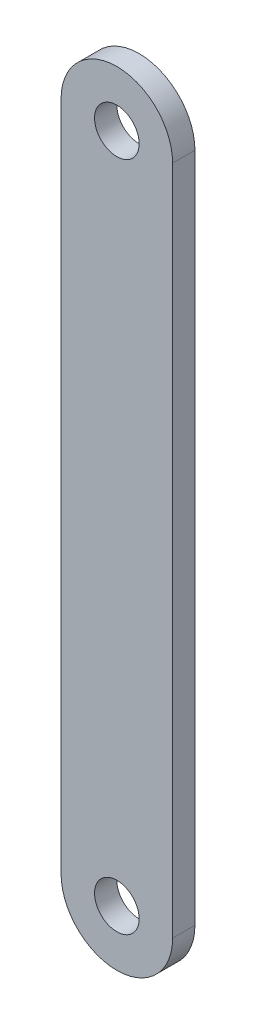
ISO-10303-21;
HEADER;
FILE_DESCRIPTION(('STEP AP214'),'2;1');
FILE_NAME('part.step','',(''),(''),'','','');
FILE_SCHEMA(('AUTOMOTIVE_DESIGN { 1 0 10303 214 1 1 1 1 }'));
ENDSEC;
DATA;
#1=APPLICATION_CONTEXT('core data for automotive mechanical design processes');
#2=APPLICATION_PROTOCOL_DEFINITION('international standard','automotive_design',2000,#1);
#3=PRODUCT_CONTEXT('',#1,'mechanical');
#4=PRODUCT('Part','Part','',(#3));
#5=PRODUCT_RELATED_PRODUCT_CATEGORY('part','',(#4));
#6=PRODUCT_DEFINITION_FORMATION('','',#4);
#7=PRODUCT_DEFINITION_CONTEXT('part definition',#1,'design');
#8=PRODUCT_DEFINITION('design','',#6,#7);
#9=PRODUCT_DEFINITION_SHAPE('','',#8);
#10=(LENGTH_UNIT() NAMED_UNIT(*) SI_UNIT(.MILLI.,.METRE.));
#11=(NAMED_UNIT(*) PLANE_ANGLE_UNIT() SI_UNIT($,.RADIAN.));
#12=(NAMED_UNIT(*) SI_UNIT($,.STERADIAN.) SOLID_ANGLE_UNIT());
#13=UNCERTAINTY_MEASURE_WITH_UNIT(LENGTH_MEASURE(1.E-05),#10,'distance_accuracy_value','');
#14=(GEOMETRIC_REPRESENTATION_CONTEXT(3) GLOBAL_UNCERTAINTY_ASSIGNED_CONTEXT((#13)) GLOBAL_UNIT_ASSIGNED_CONTEXT((#10,
#11,#12)) REPRESENTATION_CONTEXT('',''));
#15=CARTESIAN_POINT('',(0.,0.,0.));
#16=DIRECTION('',(0.,0.,1.));
#17=DIRECTION('',(1.,0.,0.));
#18=AXIS2_PLACEMENT_3D('',#15,#16,#17);
#19=CARTESIAN_POINT('',(25.,0.,10.));
#20=DIRECTION('',(0.,0.,1.));
#21=DIRECTION('',(1.,0.,0.));
#22=AXIS2_PLACEMENT_3D('',#19,#20,#21);
#23=PLANE('',#22);
#24=CARTESIAN_POINT('',(25.,300.9,10.));
#25=DIRECTION('',(0.,0.,1.));
#26=DIRECTION('',(1.,0.,0.));
#27=AXIS2_PLACEMENT_3D('',#24,#25,#26);
#28=CIRCLE('',#27,10.);
#29=CARTESIAN_POINT('',(35.,300.9,10.));
#30=VERTEX_POINT('',#29);
#31=EDGE_CURVE('E100',#30,#30,#28,.T.);
#32=ORIENTED_EDGE('',*,*,#31,.F.);
#33=EDGE_LOOP('',(#32));
#34=FACE_BOUND('',#33,.T.);
#35=CARTESIAN_POINT('',(25.,0.,10.));
#36=DIRECTION('',(0.,0.,1.));
#37=DIRECTION('',(1.,0.,0.));
#38=AXIS2_PLACEMENT_3D('',#35,#36,#37);
#39=CIRCLE('',#38,25.);
#40=CARTESIAN_POINT('',(0.,0.,10.));
#41=VERTEX_POINT('',#40);
#42=CARTESIAN_POINT('',(50.,0.,10.));
#43=VERTEX_POINT('',#42);
#44=EDGE_CURVE('E85',#41,#43,#39,.T.);
#45=ORIENTED_EDGE('',*,*,#44,.T.);
#46=DIRECTION('',(0.,1.,0.));
#47=VECTOR('',#46,1.);
#48=CARTESIAN_POINT('',(50.,0.,10.));
#49=LINE('',#48,#47);
#50=CARTESIAN_POINT('',(50.,300.9,10.));
#51=VERTEX_POINT('',#50);
#52=EDGE_CURVE('E80',#43,#51,#49,.T.);
#53=ORIENTED_EDGE('',*,*,#52,.T.);
#54=CARTESIAN_POINT('',(25.,300.9,10.));
#55=DIRECTION('',(0.,0.,1.));
#56=DIRECTION('',(1.,0.,0.));
#57=AXIS2_PLACEMENT_3D('',#54,#55,#56);
#58=CIRCLE('',#57,25.);
#59=CARTESIAN_POINT('',(0.,300.9,10.));
#60=VERTEX_POINT('',#59);
#61=EDGE_CURVE('E83',#51,#60,#58,.T.);
#62=ORIENTED_EDGE('',*,*,#61,.T.);
#63=DIRECTION('',(0.,-1.,0.));
#64=VECTOR('',#63,1.);
#65=CARTESIAN_POINT('',(0.,300.9,10.));
#66=LINE('',#65,#64);
#67=EDGE_CURVE('E50',#60,#41,#66,.T.);
#68=ORIENTED_EDGE('',*,*,#67,.T.);
#69=EDGE_LOOP('',(#45,#53,#62,#68));
#70=FACE_BOUND('',#69,.T.);
#71=CARTESIAN_POINT('',(25.,0.,10.));
#72=DIRECTION('',(0.,0.,1.));
#73=DIRECTION('',(1.,0.,0.));
#74=AXIS2_PLACEMENT_3D('',#71,#72,#73);
#75=CIRCLE('',#74,10.);
#76=CARTESIAN_POINT('',(35.,0.,10.));
#77=VERTEX_POINT('',#76);
#78=EDGE_CURVE('E115',#77,#77,#75,.T.);
#79=ORIENTED_EDGE('',*,*,#78,.F.);
#80=EDGE_LOOP('',(#79));
#81=FACE_BOUND('',#80,.T.);
#82=ADVANCED_FACE('F33',(#34,#70,#81),#23,.T.);
#83=CARTESIAN_POINT('',(25.,0.,0.));
#84=DIRECTION('',(0.,0.,1.));
#85=DIRECTION('',(1.,0.,0.));
#86=AXIS2_PLACEMENT_3D('',#83,#84,#85);
#87=PLANE('',#86);
#88=CARTESIAN_POINT('',(25.,300.9,0.));
#89=DIRECTION('',(0.,0.,1.));
#90=DIRECTION('',(1.,0.,0.));
#91=AXIS2_PLACEMENT_3D('',#88,#89,#90);
#92=CIRCLE('',#91,10.);
#93=CARTESIAN_POINT('',(35.,300.9,0.));
#94=VERTEX_POINT('',#93);
#95=EDGE_CURVE('E112',#94,#94,#92,.T.);
#96=ORIENTED_EDGE('',*,*,#95,.T.);
#97=EDGE_LOOP('',(#96));
#98=FACE_BOUND('',#97,.T.);
#99=CARTESIAN_POINT('',(25.,0.,0.));
#100=DIRECTION('',(0.,0.,1.));
#101=DIRECTION('',(1.,0.,0.));
#102=AXIS2_PLACEMENT_3D('',#99,#100,#101);
#103=CIRCLE('',#102,25.);
#104=CARTESIAN_POINT('',(0.,0.,0.));
#105=VERTEX_POINT('',#104);
#106=CARTESIAN_POINT('',(50.,0.,0.));
#107=VERTEX_POINT('',#106);
#108=EDGE_CURVE('E97',#105,#107,#103,.T.);
#109=ORIENTED_EDGE('',*,*,#108,.F.);
#110=DIRECTION('',(0.,-1.,0.));
#111=VECTOR('',#110,1.);
#112=CARTESIAN_POINT('',(0.,300.9,0.));
#113=LINE('',#112,#111);
#114=CARTESIAN_POINT('',(0.,300.9,0.));
#115=VERTEX_POINT('',#114);
#116=EDGE_CURVE('E73',#115,#105,#113,.T.);
#117=ORIENTED_EDGE('',*,*,#116,.F.);
#118=CARTESIAN_POINT('',(25.,300.9,0.));
#119=DIRECTION('',(0.,0.,1.));
#120=DIRECTION('',(1.,0.,0.));
#121=AXIS2_PLACEMENT_3D('',#118,#119,#120);
#122=CIRCLE('',#121,25.);
#123=CARTESIAN_POINT('',(50.,300.9,0.));
#124=VERTEX_POINT('',#123);
#125=EDGE_CURVE('E67',#124,#115,#122,.T.);
#126=ORIENTED_EDGE('',*,*,#125,.F.);
#127=DIRECTION('',(0.,1.,0.));
#128=VECTOR('',#127,1.);
#129=CARTESIAN_POINT('',(50.,0.,0.));
#130=LINE('',#129,#128);
#131=EDGE_CURVE('E89',#107,#124,#130,.T.);
#132=ORIENTED_EDGE('',*,*,#131,.F.);
#133=EDGE_LOOP('',(#109,#117,#126,#132));
#134=FACE_BOUND('',#133,.T.);
#135=CARTESIAN_POINT('',(25.,0.,0.));
#136=DIRECTION('',(0.,0.,1.));
#137=DIRECTION('',(1.,0.,0.));
#138=AXIS2_PLACEMENT_3D('',#135,#136,#137);
#139=CIRCLE('',#138,10.);
#140=CARTESIAN_POINT('',(35.,0.,0.));
#141=VERTEX_POINT('',#140);
#142=EDGE_CURVE('E118',#141,#141,#139,.T.);
#143=ORIENTED_EDGE('',*,*,#142,.T.);
#144=EDGE_LOOP('',(#143));
#145=FACE_BOUND('',#144,.T.);
#146=ADVANCED_FACE('F108',(#98,#134,#145),#87,.F.);
#147=CARTESIAN_POINT('',(25.,0.,10.));
#148=DIRECTION('',(0.,0.,-1.));
#149=DIRECTION('',(-1.,0.,0.));
#150=AXIS2_PLACEMENT_3D('',#147,#148,#149);
#151=CYLINDRICAL_SURFACE('',#150,25.);
#152=ORIENTED_EDGE('',*,*,#108,.T.);
#153=DIRECTION('',(0.,0.,-1.));
#154=VECTOR('',#153,1.);
#155=CARTESIAN_POINT('',(50.,0.,10.));
#156=LINE('',#155,#154);
#157=EDGE_CURVE('E11',#43,#107,#156,.T.);
#158=ORIENTED_EDGE('',*,*,#157,.F.);
#159=ORIENTED_EDGE('',*,*,#44,.F.);
#160=DIRECTION('',(0.,0.,-1.));
#161=VECTOR('',#160,1.);
#162=CARTESIAN_POINT('',(0.,0.,10.));
#163=LINE('',#162,#161);
#164=EDGE_CURVE('E93',#41,#105,#163,.T.);
#165=ORIENTED_EDGE('',*,*,#164,.T.);
#166=EDGE_LOOP('',(#152,#158,#159,#165));
#167=FACE_BOUND('',#166,.T.);
#168=ADVANCED_FACE('F35',(#167),#151,.T.);
#169=CARTESIAN_POINT('',(50.,0.,10.));
#170=DIRECTION('',(-1.,0.,0.));
#171=DIRECTION('',(0.,-1.,0.));
#172=AXIS2_PLACEMENT_3D('',#169,#170,#171);
#173=PLANE('',#172);
#174=ORIENTED_EDGE('',*,*,#131,.T.);
#175=DIRECTION('',(0.,0.,-1.));
#176=VECTOR('',#175,1.);
#177=CARTESIAN_POINT('',(50.,300.9,10.));
#178=LINE('',#177,#176);
#179=EDGE_CURVE('E42',#51,#124,#178,.T.);
#180=ORIENTED_EDGE('',*,*,#179,.F.);
#181=ORIENTED_EDGE('',*,*,#52,.F.);
#182=ORIENTED_EDGE('',*,*,#157,.T.);
#183=EDGE_LOOP('',(#174,#180,#181,#182));
#184=FACE_BOUND('',#183,.T.);
#185=ADVANCED_FACE('F88',(#184),#173,.F.);
#186=CARTESIAN_POINT('',(25.,300.9,10.));
#187=DIRECTION('',(0.,0.,-1.));
#188=DIRECTION('',(-1.,0.,0.));
#189=AXIS2_PLACEMENT_3D('',#186,#187,#188);
#190=CYLINDRICAL_SURFACE('',#189,25.);
#191=ORIENTED_EDGE('',*,*,#125,.T.);
#192=DIRECTION('',(0.,0.,-1.));
#193=VECTOR('',#192,1.);
#194=CARTESIAN_POINT('',(0.,300.9,10.));
#195=LINE('',#194,#193);
#196=EDGE_CURVE('E90',#60,#115,#195,.T.);
#197=ORIENTED_EDGE('',*,*,#196,.F.);
#198=ORIENTED_EDGE('',*,*,#61,.F.);
#199=ORIENTED_EDGE('',*,*,#179,.T.);
#200=EDGE_LOOP('',(#191,#197,#198,#199));
#201=FACE_BOUND('',#200,.T.);
#202=ADVANCED_FACE('F91',(#201),#190,.T.);
#203=CARTESIAN_POINT('',(0.,300.9,10.));
#204=DIRECTION('',(1.,0.,0.));
#205=DIRECTION('',(0.,1.,0.));
#206=AXIS2_PLACEMENT_3D('',#203,#204,#205);
#207=PLANE('',#206);
#208=ORIENTED_EDGE('',*,*,#116,.T.);
#209=ORIENTED_EDGE('',*,*,#164,.F.);
#210=ORIENTED_EDGE('',*,*,#67,.F.);
#211=ORIENTED_EDGE('',*,*,#196,.T.);
#212=EDGE_LOOP('',(#208,#209,#210,#211));
#213=FACE_BOUND('',#212,.T.);
#214=ADVANCED_FACE('F105',(#213),#207,.F.);
#215=CARTESIAN_POINT('',(25.,300.9,10.));
#216=DIRECTION('',(0.,0.,-1.));
#217=DIRECTION('',(-1.,0.,0.));
#218=AXIS2_PLACEMENT_3D('',#215,#216,#217);
#219=CYLINDRICAL_SURFACE('',#218,10.);
#220=ORIENTED_EDGE('',*,*,#31,.T.);
#221=EDGE_LOOP('',(#220));
#222=FACE_BOUND('',#221,.T.);
#223=ORIENTED_EDGE('',*,*,#95,.F.);
#224=EDGE_LOOP('',(#223));
#225=FACE_BOUND('',#224,.T.);
#226=ADVANCED_FACE('F136',(#222,#225),#219,.F.);
#227=CARTESIAN_POINT('',(25.,0.,10.));
#228=DIRECTION('',(0.,0.,-1.));
#229=DIRECTION('',(-1.,0.,0.));
#230=AXIS2_PLACEMENT_3D('',#227,#228,#229);
#231=CYLINDRICAL_SURFACE('',#230,10.);
#232=ORIENTED_EDGE('',*,*,#78,.T.);
#233=EDGE_LOOP('',(#232));
#234=FACE_BOUND('',#233,.T.);
#235=ORIENTED_EDGE('',*,*,#142,.F.);
#236=EDGE_LOOP('',(#235));
#237=FACE_BOUND('',#236,.T.);
#238=ADVANCED_FACE('F124',(#234,#237),#231,.F.);
#239=CLOSED_SHELL('',(#82,#146,#168,#185,#202,#214,#226,#238));
#240=MANIFOLD_SOLID_BREP('B2',#239);
#241=ADVANCED_BREP_SHAPE_REPRESENTATION('',(#18,#240),#14);
#242=SHAPE_DEFINITION_REPRESENTATION(#9,#241);
ENDSEC;
END-ISO-10303-21;
